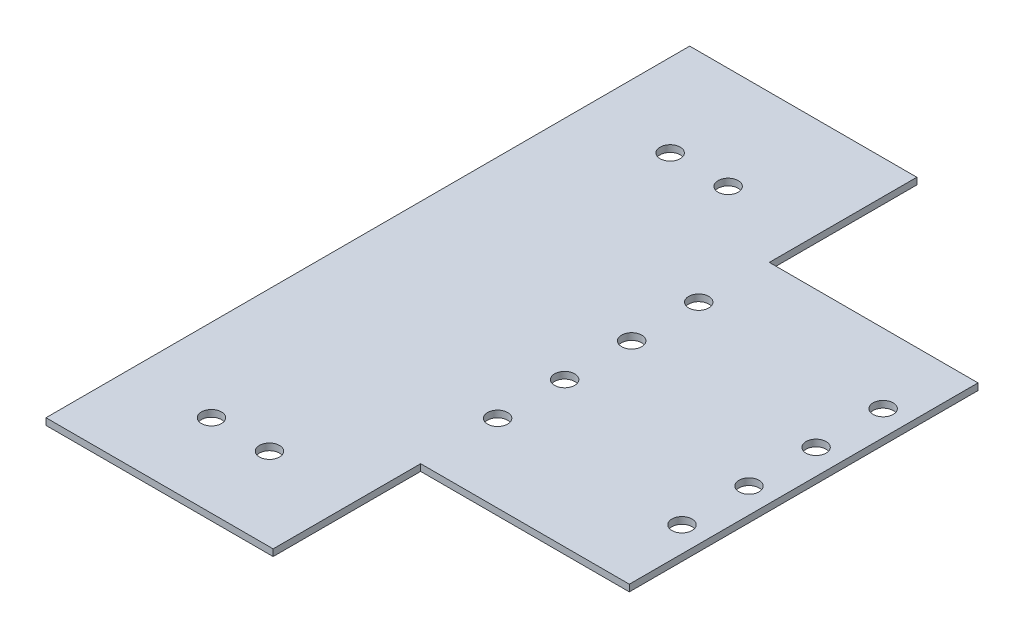
ISO-10303-21;
HEADER;
FILE_DESCRIPTION(('STEP AP214'),'2;1');
FILE_NAME('part.step','',(''),(''),'','','');
FILE_SCHEMA(('AUTOMOTIVE_DESIGN { 1 0 10303 214 1 1 1 1 }'));
ENDSEC;
DATA;
#1=APPLICATION_CONTEXT('core data for automotive mechanical design processes');
#2=APPLICATION_PROTOCOL_DEFINITION('international standard','automotive_design',2000,#1);
#3=PRODUCT_CONTEXT('',#1,'mechanical');
#4=PRODUCT('Part','Part','',(#3));
#5=PRODUCT_RELATED_PRODUCT_CATEGORY('part','',(#4));
#6=PRODUCT_DEFINITION_FORMATION('','',#4);
#7=PRODUCT_DEFINITION_CONTEXT('part definition',#1,'design');
#8=PRODUCT_DEFINITION('design','',#6,#7);
#9=PRODUCT_DEFINITION_SHAPE('','',#8);
#10=(LENGTH_UNIT() NAMED_UNIT(*) SI_UNIT(.MILLI.,.METRE.));
#11=(NAMED_UNIT(*) PLANE_ANGLE_UNIT() SI_UNIT($,.RADIAN.));
#12=(NAMED_UNIT(*) SI_UNIT($,.STERADIAN.) SOLID_ANGLE_UNIT());
#13=UNCERTAINTY_MEASURE_WITH_UNIT(LENGTH_MEASURE(1.E-05),#10,'distance_accuracy_value','');
#14=(GEOMETRIC_REPRESENTATION_CONTEXT(3) GLOBAL_UNCERTAINTY_ASSIGNED_CONTEXT((#13)) GLOBAL_UNIT_ASSIGNED_CONTEXT((#10,
#11,#12)) REPRESENTATION_CONTEXT('',''));
#15=CARTESIAN_POINT('',(0.,0.,0.));
#16=DIRECTION('',(0.,0.,1.));
#17=DIRECTION('',(1.,0.,0.));
#18=AXIS2_PLACEMENT_3D('',#15,#16,#17);
#19=CARTESIAN_POINT('',(0.,1.,0.));
#20=DIRECTION('',(0.,-1.,0.));
#21=DIRECTION('',(0.,0.,-1.));
#22=AXIS2_PLACEMENT_3D('',#19,#20,#21);
#23=PLANE('',#22);
#24=CARTESIAN_POINT('',(5.92356900920418,1.,35.6602207894241));
#25=DIRECTION('',(0.,1.,0.));
#26=DIRECTION('',(0.,0.,1.));
#27=AXIS2_PLACEMENT_3D('',#24,#25,#26);
#28=CIRCLE('',#27,1.5);
#29=CARTESIAN_POINT('',(5.92356900920418,1.,37.1602207894241));
#30=VERTEX_POINT('',#29);
#31=EDGE_CURVE('E239',#30,#30,#28,.T.);
#32=ORIENTED_EDGE('',*,*,#31,.F.);
#33=EDGE_LOOP('',(#32));
#34=FACE_BOUND('',#33,.T.);
#35=CARTESIAN_POINT('',(-2.72643099079582,1.,35.6602207894241));
#36=DIRECTION('',(0.,1.,0.));
#37=DIRECTION('',(0.,0.,1.));
#38=AXIS2_PLACEMENT_3D('',#35,#36,#37);
#39=CIRCLE('',#38,1.5);
#40=CARTESIAN_POINT('',(-2.72643099079582,1.,37.1602207894241));
#41=VERTEX_POINT('',#40);
#42=EDGE_CURVE('E257',#41,#41,#39,.T.);
#43=ORIENTED_EDGE('',*,*,#42,.F.);
#44=EDGE_LOOP('',(#43));
#45=FACE_BOUND('',#44,.T.);
#46=CARTESIAN_POINT('',(-2.72643099079582,1.,-32.7469767878305));
#47=DIRECTION('',(0.,1.,0.));
#48=DIRECTION('',(0.,0.,1.));
#49=AXIS2_PLACEMENT_3D('',#46,#47,#48);
#50=CIRCLE('',#49,1.5);
#51=CARTESIAN_POINT('',(-2.72643099079582,1.,-31.2469767878306));
#52=VERTEX_POINT('',#51);
#53=EDGE_CURVE('E254',#52,#52,#50,.T.);
#54=ORIENTED_EDGE('',*,*,#53,.F.);
#55=EDGE_LOOP('',(#54));
#56=FACE_BOUND('',#55,.T.);
#57=CARTESIAN_POINT('',(5.92356900920418,1.,-32.7469767878305));
#58=DIRECTION('',(0.,1.,0.));
#59=DIRECTION('',(0.,0.,1.));
#60=AXIS2_PLACEMENT_3D('',#57,#58,#59);
#61=CIRCLE('',#60,1.5);
#62=CARTESIAN_POINT('',(5.92356900920418,1.,-31.2469767878306));
#63=VERTEX_POINT('',#62);
#64=EDGE_CURVE('E183',#63,#63,#61,.T.);
#65=ORIENTED_EDGE('',*,*,#64,.F.);
#66=EDGE_LOOP('',(#65));
#67=FACE_BOUND('',#66,.T.);
#68=CARTESIAN_POINT('',(46.1837979810975,1.,-5.59999999995909));
#69=DIRECTION('',(0.,1.,0.));
#70=DIRECTION('',(0.,0.,1.));
#71=AXIS2_PLACEMENT_3D('',#68,#69,#70);
#72=CIRCLE('',#71,1.50000000001881);
#73=CARTESIAN_POINT('',(46.1837979810975,1.,-4.09999999994028));
#74=VERTEX_POINT('',#73);
#75=EDGE_CURVE('E205',#74,#74,#72,.T.);
#76=ORIENTED_EDGE('',*,*,#75,.F.);
#77=EDGE_LOOP('',(#76));
#78=FACE_BOUND('',#77,.T.);
#79=CARTESIAN_POINT('',(18.6837979810975,1.,4.40000000004091));
#80=DIRECTION('',(0.,1.,0.));
#81=DIRECTION('',(0.,0.,1.));
#82=AXIS2_PLACEMENT_3D('',#79,#80,#81);
#83=CIRCLE('',#82,1.50000000001833);
#84=CARTESIAN_POINT('',(18.6837979810975,1.,5.90000000005924));
#85=VERTEX_POINT('',#84);
#86=EDGE_CURVE('E207',#85,#85,#83,.T.);
#87=ORIENTED_EDGE('',*,*,#86,.F.);
#88=EDGE_LOOP('',(#87));
#89=FACE_BOUND('',#88,.T.);
#90=CARTESIAN_POINT('',(46.1837979810975,1.,4.40000000004091));
#91=DIRECTION('',(0.,1.,0.));
#92=DIRECTION('',(0.,0.,1.));
#93=AXIS2_PLACEMENT_3D('',#90,#91,#92);
#94=CIRCLE('',#93,1.50000000001881);
#95=CARTESIAN_POINT('',(46.1837979810975,1.,5.90000000005972));
#96=VERTEX_POINT('',#95);
#97=EDGE_CURVE('E210',#96,#96,#94,.T.);
#98=ORIENTED_EDGE('',*,*,#97,.F.);
#99=EDGE_LOOP('',(#98));
#100=FACE_BOUND('',#99,.T.);
#101=CARTESIAN_POINT('',(18.6837979810975,1.,14.4000000000409));
#102=DIRECTION('',(0.,1.,0.));
#103=DIRECTION('',(0.,0.,1.));
#104=AXIS2_PLACEMENT_3D('',#101,#102,#103);
#105=CIRCLE('',#104,1.50000000001833);
#106=CARTESIAN_POINT('',(18.6837979810975,1.,15.9000000000592));
#107=VERTEX_POINT('',#106);
#108=EDGE_CURVE('E213',#107,#107,#105,.T.);
#109=ORIENTED_EDGE('',*,*,#108,.F.);
#110=EDGE_LOOP('',(#109));
#111=FACE_BOUND('',#110,.T.);
#112=CARTESIAN_POINT('',(18.6837979810974,1.,-15.5999999999591));
#113=DIRECTION('',(0.,1.,0.));
#114=DIRECTION('',(0.,0.,1.));
#115=AXIS2_PLACEMENT_3D('',#112,#113,#114);
#116=CIRCLE('',#115,1.50000000001833);
#117=CARTESIAN_POINT('',(18.6837979810974,1.,-14.0999999999408));
#118=VERTEX_POINT('',#117);
#119=EDGE_CURVE('E190',#118,#118,#116,.T.);
#120=ORIENTED_EDGE('',*,*,#119,.F.);
#121=EDGE_LOOP('',(#120));
#122=FACE_BOUND('',#121,.T.);
#123=CARTESIAN_POINT('',(46.1837979810974,1.,-15.5999999999591));
#124=DIRECTION('',(0.,1.,0.));
#125=DIRECTION('',(0.,0.,1.));
#126=AXIS2_PLACEMENT_3D('',#123,#124,#125);
#127=CIRCLE('',#126,1.50000000001881);
#128=CARTESIAN_POINT('',(46.1837979810974,1.,-14.0999999999403));
#129=VERTEX_POINT('',#128);
#130=EDGE_CURVE('E194',#129,#129,#127,.T.);
#131=ORIENTED_EDGE('',*,*,#130,.F.);
#132=EDGE_LOOP('',(#131));
#133=FACE_BOUND('',#132,.T.);
#134=CARTESIAN_POINT('',(18.6837979810975,1.,-5.59999999995909));
#135=DIRECTION('',(0.,1.,0.));
#136=DIRECTION('',(0.,0.,1.));
#137=AXIS2_PLACEMENT_3D('',#134,#135,#136);
#138=CIRCLE('',#137,1.50000000001833);
#139=CARTESIAN_POINT('',(18.6837979810975,1.,-4.09999999994076));
#140=VERTEX_POINT('',#139);
#141=EDGE_CURVE('E199',#140,#140,#138,.T.);
#142=ORIENTED_EDGE('',*,*,#141,.F.);
#143=EDGE_LOOP('',(#142));
#144=FACE_BOUND('',#143,.T.);
#145=CARTESIAN_POINT('',(46.1837979810975,1.,14.4000000000409));
#146=DIRECTION('',(0.,1.,0.));
#147=DIRECTION('',(0.,0.,1.));
#148=AXIS2_PLACEMENT_3D('',#145,#146,#147);
#149=CIRCLE('',#148,1.50000000001881);
#150=CARTESIAN_POINT('',(46.1837979810975,1.,15.9000000000597));
#151=VERTEX_POINT('',#150);
#152=EDGE_CURVE('E159',#151,#151,#149,.T.);
#153=ORIENTED_EDGE('',*,*,#152,.F.);
#154=EDGE_LOOP('',(#153));
#155=FACE_BOUND('',#154,.T.);
#156=DIRECTION('',(-1.,0.,0.));
#157=VECTOR('',#156,1.);
#158=CARTESIAN_POINT('',(15.,1.,-47.999999999969));
#159=LINE('',#158,#157);
#160=CARTESIAN_POINT('',(18.8099324408469,1.,-47.999999999969));
#161=VERTEX_POINT('',#160);
#162=CARTESIAN_POINT('',(-15.0662020189026,1.,-47.999999999969));
#163=VERTEX_POINT('',#162);
#164=EDGE_CURVE('E130',#161,#163,#159,.T.);
#165=ORIENTED_EDGE('',*,*,#164,.T.);
#166=DIRECTION('',(0.,0.,1.));
#167=VECTOR('',#166,1.);
#168=CARTESIAN_POINT('',(-15.0662020189026,1.,0.));
#169=LINE('',#168,#167);
#170=CARTESIAN_POINT('',(-15.0662020189026,0.999999999999999,48.000000000031));
#171=VERTEX_POINT('',#170);
#172=EDGE_CURVE('E52',#163,#171,#169,.T.);
#173=ORIENTED_EDGE('',*,*,#172,.T.);
#174=DIRECTION('',(1.,0.,1.61649475190916E-13));
#175=VECTOR('',#174,1.);
#176=CARTESIAN_POINT('',(-48.9590812442226,1.,48.000000000031));
#177=LINE('',#176,#175);
#178=CARTESIAN_POINT('',(18.8099324408469,1.,48.0000000000413));
#179=VERTEX_POINT('',#178);
#180=EDGE_CURVE('E96',#171,#179,#177,.T.);
#181=ORIENTED_EDGE('',*,*,#180,.T.);
#182=DIRECTION('',(0.,0.,-1.));
#183=VECTOR('',#182,1.);
#184=CARTESIAN_POINT('',(18.8099324408469,1.,26.000000000031));
#185=LINE('',#184,#183);
#186=CARTESIAN_POINT('',(18.8099324408469,1.,26.000000000031));
#187=VERTEX_POINT('',#186);
#188=EDGE_CURVE('E221',#179,#187,#185,.T.);
#189=ORIENTED_EDGE('',*,*,#188,.T.);
#190=DIRECTION('',(1.,0.,0.));
#191=VECTOR('',#190,1.);
#192=CARTESIAN_POINT('',(49.9337979810974,1.,26.000000000031));
#193=LINE('',#192,#191);
#194=CARTESIAN_POINT('',(49.9337979810974,1.,26.000000000031));
#195=VERTEX_POINT('',#194);
#196=EDGE_CURVE('E112',#187,#195,#193,.T.);
#197=ORIENTED_EDGE('',*,*,#196,.T.);
#198=DIRECTION('',(0.,0.,-1.));
#199=VECTOR('',#198,1.);
#200=CARTESIAN_POINT('',(49.9337979810974,1.,-25.9999999999587));
#201=LINE('',#200,#199);
#202=CARTESIAN_POINT('',(49.9337979810974,1.,-25.9999999999587));
#203=VERTEX_POINT('',#202);
#204=EDGE_CURVE('E106',#195,#203,#201,.T.);
#205=ORIENTED_EDGE('',*,*,#204,.T.);
#206=DIRECTION('',(-1.,0.,0.));
#207=VECTOR('',#206,1.);
#208=CARTESIAN_POINT('',(49.9337979810974,1.,-25.9999999999587));
#209=LINE('',#208,#207);
#210=CARTESIAN_POINT('',(18.8099324408469,1.,-25.9999999999587));
#211=VERTEX_POINT('',#210);
#212=EDGE_CURVE('E109',#203,#211,#209,.T.);
#213=ORIENTED_EDGE('',*,*,#212,.T.);
#214=DIRECTION('',(0.,0.,-1.));
#215=VECTOR('',#214,1.);
#216=CARTESIAN_POINT('',(18.8099324408469,1.,-25.9999999999587));
#217=LINE('',#216,#215);
#218=EDGE_CURVE('E61',#211,#161,#217,.T.);
#219=ORIENTED_EDGE('',*,*,#218,.T.);
#220=EDGE_LOOP('',(#165,#173,#181,#189,#197,#205,#213,#219));
#221=FACE_BOUND('',#220,.T.);
#222=ADVANCED_FACE('F35',(#34,#45,#56,#67,#78,#89,#100,#111,#122,#133,#144,#155,#221),#23,.F.);
#223=CARTESIAN_POINT('',(0.,0.,0.));
#224=DIRECTION('',(0.,-1.,0.));
#225=DIRECTION('',(0.,0.,-1.));
#226=AXIS2_PLACEMENT_3D('',#223,#224,#225);
#227=PLANE('',#226);
#228=DIRECTION('',(0.,0.,1.));
#229=VECTOR('',#228,1.);
#230=CARTESIAN_POINT('',(-15.0662020189026,0.,-47.9999999999586));
#231=LINE('',#230,#229);
#232=CARTESIAN_POINT('',(-15.0662020189026,0.,-47.9999999999586));
#233=VERTEX_POINT('',#232);
#234=CARTESIAN_POINT('',(-15.0662020189026,0.,48.000000000031));
#235=VERTEX_POINT('',#234);
#236=EDGE_CURVE('E247',#233,#235,#231,.T.);
#237=ORIENTED_EDGE('',*,*,#236,.F.);
#238=DIRECTION('',(-1.,0.,1.61866454352247E-13));
#239=VECTOR('',#238,1.);
#240=CARTESIAN_POINT('',(-48.9590812442226,0.,-47.9999999999586));
#241=LINE('',#240,#239);
#242=CARTESIAN_POINT('',(18.8099324408469,0.,-47.999999999969));
#243=VERTEX_POINT('',#242);
#244=EDGE_CURVE('E89',#243,#233,#241,.T.);
#245=ORIENTED_EDGE('',*,*,#244,.F.);
#246=DIRECTION('',(0.,0.,-1.));
#247=VECTOR('',#246,1.);
#248=CARTESIAN_POINT('',(18.8099324408469,0.,-25.9999999999587));
#249=LINE('',#248,#247);
#250=CARTESIAN_POINT('',(18.8099324408469,0.,-25.9999999999587));
#251=VERTEX_POINT('',#250);
#252=EDGE_CURVE('E146',#251,#243,#249,.T.);
#253=ORIENTED_EDGE('',*,*,#252,.F.);
#254=DIRECTION('',(-1.,0.,0.));
#255=VECTOR('',#254,1.);
#256=CARTESIAN_POINT('',(49.9337979810974,0.,-25.9999999999587));
#257=LINE('',#256,#255);
#258=CARTESIAN_POINT('',(49.9337979810974,0.,-25.9999999999587));
#259=VERTEX_POINT('',#258);
#260=EDGE_CURVE('E144',#259,#251,#257,.T.);
#261=ORIENTED_EDGE('',*,*,#260,.F.);
#262=DIRECTION('',(0.,0.,-1.));
#263=VECTOR('',#262,1.);
#264=CARTESIAN_POINT('',(49.9337979810974,0.,-25.9999999999587));
#265=LINE('',#264,#263);
#266=CARTESIAN_POINT('',(49.9337979810974,0.,26.000000000031));
#267=VERTEX_POINT('',#266);
#268=EDGE_CURVE('E121',#267,#259,#265,.T.);
#269=ORIENTED_EDGE('',*,*,#268,.F.);
#270=DIRECTION('',(1.,0.,0.));
#271=VECTOR('',#270,1.);
#272=CARTESIAN_POINT('',(49.9337979810974,0.,26.000000000031));
#273=LINE('',#272,#271);
#274=CARTESIAN_POINT('',(18.8099324408469,0.,26.000000000031));
#275=VERTEX_POINT('',#274);
#276=EDGE_CURVE('E141',#275,#267,#273,.T.);
#277=ORIENTED_EDGE('',*,*,#276,.F.);
#278=DIRECTION('',(0.,0.,-1.));
#279=VECTOR('',#278,1.);
#280=CARTESIAN_POINT('',(18.8099324408469,0.,26.000000000031));
#281=LINE('',#280,#279);
#282=CARTESIAN_POINT('',(18.8099324408469,0.,48.0000000000413));
#283=VERTEX_POINT('',#282);
#284=EDGE_CURVE('E138',#283,#275,#281,.T.);
#285=ORIENTED_EDGE('',*,*,#284,.F.);
#286=DIRECTION('',(1.,0.,0.));
#287=VECTOR('',#286,1.);
#288=CARTESIAN_POINT('',(15.,0.,48.0000000000413));
#289=LINE('',#288,#287);
#290=EDGE_CURVE('E136',#235,#283,#289,.T.);
#291=ORIENTED_EDGE('',*,*,#290,.F.);
#292=EDGE_LOOP('',(#237,#245,#253,#261,#269,#277,#285,#291));
#293=FACE_BOUND('',#292,.T.);
#294=CARTESIAN_POINT('',(5.92356900920418,0.,35.6602207894241));
#295=DIRECTION('',(0.,-1.,0.));
#296=DIRECTION('',(0.,0.,-1.));
#297=AXIS2_PLACEMENT_3D('',#294,#295,#296);
#298=CIRCLE('',#297,1.5);
#299=CARTESIAN_POINT('',(5.92356900920418,0.,34.1602207894241));
#300=VERTEX_POINT('',#299);
#301=EDGE_CURVE('E39',#300,#300,#298,.T.);
#302=ORIENTED_EDGE('',*,*,#301,.F.);
#303=EDGE_LOOP('',(#302));
#304=FACE_BOUND('',#303,.T.);
#305=CARTESIAN_POINT('',(-2.72643099079582,0.,35.6602207894241));
#306=DIRECTION('',(0.,-1.,0.));
#307=DIRECTION('',(0.,0.,-1.));
#308=AXIS2_PLACEMENT_3D('',#305,#306,#307);
#309=CIRCLE('',#308,1.5);
#310=CARTESIAN_POINT('',(-2.72643099079582,0.,34.1602207894241));
#311=VERTEX_POINT('',#310);
#312=EDGE_CURVE('E185',#311,#311,#309,.T.);
#313=ORIENTED_EDGE('',*,*,#312,.F.);
#314=EDGE_LOOP('',(#313));
#315=FACE_BOUND('',#314,.T.);
#316=CARTESIAN_POINT('',(-2.72643099079582,0.,-32.7469767878305));
#317=DIRECTION('',(0.,-1.,0.));
#318=DIRECTION('',(0.,0.,-1.));
#319=AXIS2_PLACEMENT_3D('',#316,#317,#318);
#320=CIRCLE('',#319,1.5);
#321=CARTESIAN_POINT('',(-2.72643099079582,0.,-34.2469767878305));
#322=VERTEX_POINT('',#321);
#323=EDGE_CURVE('E182',#322,#322,#320,.T.);
#324=ORIENTED_EDGE('',*,*,#323,.F.);
#325=EDGE_LOOP('',(#324));
#326=FACE_BOUND('',#325,.T.);
#327=CARTESIAN_POINT('',(5.92356900920418,0.,-32.7469767878305));
#328=DIRECTION('',(0.,-1.,0.));
#329=DIRECTION('',(0.,0.,-1.));
#330=AXIS2_PLACEMENT_3D('',#327,#328,#329);
#331=CIRCLE('',#330,1.5);
#332=CARTESIAN_POINT('',(5.92356900920418,0.,-34.2469767878305));
#333=VERTEX_POINT('',#332);
#334=EDGE_CURVE('E179',#333,#333,#331,.T.);
#335=ORIENTED_EDGE('',*,*,#334,.F.);
#336=EDGE_LOOP('',(#335));
#337=FACE_BOUND('',#336,.T.);
#338=CARTESIAN_POINT('',(46.1837979810975,0.,-5.59999999995909));
#339=DIRECTION('',(0.,-1.,0.));
#340=DIRECTION('',(0.,0.,-1.));
#341=AXIS2_PLACEMENT_3D('',#338,#339,#340);
#342=CIRCLE('',#341,1.50000000001881);
#343=CARTESIAN_POINT('',(46.1837979810975,0.,-7.0999999999779));
#344=VERTEX_POINT('',#343);
#345=EDGE_CURVE('E139',#344,#344,#342,.T.);
#346=ORIENTED_EDGE('',*,*,#345,.F.);
#347=EDGE_LOOP('',(#346));
#348=FACE_BOUND('',#347,.T.);
#349=CARTESIAN_POINT('',(18.6837979810975,0.,4.40000000004091));
#350=DIRECTION('',(0.,-1.,0.));
#351=DIRECTION('',(0.,0.,-1.));
#352=AXIS2_PLACEMENT_3D('',#349,#350,#351);
#353=CIRCLE('',#352,1.50000000001833);
#354=CARTESIAN_POINT('',(18.6837979810975,0.,2.90000000002258));
#355=VERTEX_POINT('',#354);
#356=EDGE_CURVE('E174',#355,#355,#353,.T.);
#357=ORIENTED_EDGE('',*,*,#356,.F.);
#358=EDGE_LOOP('',(#357));
#359=FACE_BOUND('',#358,.T.);
#360=CARTESIAN_POINT('',(46.1837979810975,0.,4.40000000004091));
#361=DIRECTION('',(0.,-1.,0.));
#362=DIRECTION('',(0.,0.,-1.));
#363=AXIS2_PLACEMENT_3D('',#360,#361,#362);
#364=CIRCLE('',#363,1.50000000001881);
#365=CARTESIAN_POINT('',(46.1837979810975,0.,2.9000000000221));
#366=VERTEX_POINT('',#365);
#367=EDGE_CURVE('E171',#366,#366,#364,.T.);
#368=ORIENTED_EDGE('',*,*,#367,.F.);
#369=EDGE_LOOP('',(#368));
#370=FACE_BOUND('',#369,.T.);
#371=CARTESIAN_POINT('',(18.6837979810975,0.,14.4000000000409));
#372=DIRECTION('',(0.,-1.,0.));
#373=DIRECTION('',(0.,0.,-1.));
#374=AXIS2_PLACEMENT_3D('',#371,#372,#373);
#375=CIRCLE('',#374,1.50000000001833);
#376=CARTESIAN_POINT('',(18.6837979810975,0.,12.9000000000226));
#377=VERTEX_POINT('',#376);
#378=EDGE_CURVE('E168',#377,#377,#375,.T.);
#379=ORIENTED_EDGE('',*,*,#378,.F.);
#380=EDGE_LOOP('',(#379));
#381=FACE_BOUND('',#380,.T.);
#382=CARTESIAN_POINT('',(18.6837979810974,0.,-15.5999999999591));
#383=DIRECTION('',(0.,-1.,0.));
#384=DIRECTION('',(0.,0.,-1.));
#385=AXIS2_PLACEMENT_3D('',#382,#383,#384);
#386=CIRCLE('',#385,1.50000000001833);
#387=CARTESIAN_POINT('',(18.6837979810974,0.,-17.0999999999774));
#388=VERTEX_POINT('',#387);
#389=EDGE_CURVE('E165',#388,#388,#386,.T.);
#390=ORIENTED_EDGE('',*,*,#389,.F.);
#391=EDGE_LOOP('',(#390));
#392=FACE_BOUND('',#391,.T.);
#393=CARTESIAN_POINT('',(46.1837979810974,0.,-15.5999999999591));
#394=DIRECTION('',(0.,-1.,0.));
#395=DIRECTION('',(0.,0.,-1.));
#396=AXIS2_PLACEMENT_3D('',#393,#394,#395);
#397=CIRCLE('',#396,1.50000000001881);
#398=CARTESIAN_POINT('',(46.1837979810974,0.,-17.0999999999779));
#399=VERTEX_POINT('',#398);
#400=EDGE_CURVE('E162',#399,#399,#397,.T.);
#401=ORIENTED_EDGE('',*,*,#400,.F.);
#402=EDGE_LOOP('',(#401));
#403=FACE_BOUND('',#402,.T.);
#404=CARTESIAN_POINT('',(18.6837979810975,0.,-5.59999999995909));
#405=DIRECTION('',(0.,-1.,0.));
#406=DIRECTION('',(0.,0.,-1.));
#407=AXIS2_PLACEMENT_3D('',#404,#405,#406);
#408=CIRCLE('',#407,1.50000000001833);
#409=CARTESIAN_POINT('',(18.6837979810975,0.,-7.09999999997742));
#410=VERTEX_POINT('',#409);
#411=EDGE_CURVE('E158',#410,#410,#408,.T.);
#412=ORIENTED_EDGE('',*,*,#411,.F.);
#413=EDGE_LOOP('',(#412));
#414=FACE_BOUND('',#413,.T.);
#415=CARTESIAN_POINT('',(46.1837979810975,0.,14.4000000000409));
#416=DIRECTION('',(0.,-1.,0.));
#417=DIRECTION('',(0.,0.,-1.));
#418=AXIS2_PLACEMENT_3D('',#415,#416,#417);
#419=CIRCLE('',#418,1.50000000001881);
#420=CARTESIAN_POINT('',(46.1837979810975,0.,12.9000000000221));
#421=VERTEX_POINT('',#420);
#422=EDGE_CURVE('E155',#421,#421,#419,.T.);
#423=ORIENTED_EDGE('',*,*,#422,.F.);
#424=EDGE_LOOP('',(#423));
#425=FACE_BOUND('',#424,.T.);
#426=ADVANCED_FACE('F230',(#293,#304,#315,#326,#337,#348,#359,#370,#381,#392,#403,#414,#425),
#227,.T.);
#427=CARTESIAN_POINT('',(15.,1.,48.0000000000413));
#428=DIRECTION('',(0.,0.,-1.));
#429=DIRECTION('',(-1.,0.,0.));
#430=AXIS2_PLACEMENT_3D('',#427,#428,#429);
#431=PLANE('',#430);
#432=ORIENTED_EDGE('',*,*,#180,.F.);
#433=DIRECTION('',(0.,-1.,0.));
#434=VECTOR('',#433,1.);
#435=CARTESIAN_POINT('',(-15.0662020189026,10.,48.000000000031));
#436=LINE('',#435,#434);
#437=EDGE_CURVE('E240',#171,#235,#436,.T.);
#438=ORIENTED_EDGE('',*,*,#437,.T.);
#439=ORIENTED_EDGE('',*,*,#290,.T.);
#440=DIRECTION('',(0.,-1.,0.));
#441=VECTOR('',#440,1.);
#442=CARTESIAN_POINT('',(18.8099324408469,1.,48.0000000000413));
#443=LINE('',#442,#441);
#444=EDGE_CURVE('E11',#179,#283,#443,.T.);
#445=ORIENTED_EDGE('',*,*,#444,.F.);
#446=EDGE_LOOP('',(#432,#438,#439,#445));
#447=FACE_BOUND('',#446,.T.);
#448=ADVANCED_FACE('F37',(#447),#431,.F.);
#449=CARTESIAN_POINT('',(18.8099324408469,1.,26.000000000031));
#450=DIRECTION('',(-1.,0.,0.));
#451=DIRECTION('',(0.,0.,1.));
#452=AXIS2_PLACEMENT_3D('',#449,#450,#451);
#453=PLANE('',#452);
#454=ORIENTED_EDGE('',*,*,#284,.T.);
#455=DIRECTION('',(0.,-1.,0.));
#456=VECTOR('',#455,1.);
#457=CARTESIAN_POINT('',(18.8099324408469,1.,26.000000000031));
#458=LINE('',#457,#456);
#459=EDGE_CURVE('E44',#187,#275,#458,.T.);
#460=ORIENTED_EDGE('',*,*,#459,.F.);
#461=ORIENTED_EDGE('',*,*,#188,.F.);
#462=ORIENTED_EDGE('',*,*,#444,.T.);
#463=EDGE_LOOP('',(#454,#460,#461,#462));
#464=FACE_BOUND('',#463,.T.);
#465=ADVANCED_FACE('F225',(#464),#453,.F.);
#466=CARTESIAN_POINT('',(49.9337979810974,1.,26.000000000031));
#467=DIRECTION('',(0.,0.,-1.));
#468=DIRECTION('',(-1.,0.,0.));
#469=AXIS2_PLACEMENT_3D('',#466,#467,#468);
#470=PLANE('',#469);
#471=ORIENTED_EDGE('',*,*,#276,.T.);
#472=DIRECTION('',(0.,-1.,0.));
#473=VECTOR('',#472,1.);
#474=CARTESIAN_POINT('',(49.9337979810974,1.,26.000000000031));
#475=LINE('',#474,#473);
#476=EDGE_CURVE('E124',#195,#267,#475,.T.);
#477=ORIENTED_EDGE('',*,*,#476,.F.);
#478=ORIENTED_EDGE('',*,*,#196,.F.);
#479=ORIENTED_EDGE('',*,*,#459,.T.);
#480=EDGE_LOOP('',(#471,#477,#478,#479));
#481=FACE_BOUND('',#480,.T.);
#482=ADVANCED_FACE('F229',(#481),#470,.F.);
#483=CARTESIAN_POINT('',(49.9337979810974,1.,-25.9999999999587));
#484=DIRECTION('',(-1.,0.,0.));
#485=DIRECTION('',(0.,0.,1.));
#486=AXIS2_PLACEMENT_3D('',#483,#484,#485);
#487=PLANE('',#486);
#488=ORIENTED_EDGE('',*,*,#268,.T.);
#489=DIRECTION('',(0.,-1.,0.));
#490=VECTOR('',#489,1.);
#491=CARTESIAN_POINT('',(49.9337979810974,1.,-25.9999999999587));
#492=LINE('',#491,#490);
#493=EDGE_CURVE('E118',#203,#259,#492,.T.);
#494=ORIENTED_EDGE('',*,*,#493,.F.);
#495=ORIENTED_EDGE('',*,*,#204,.F.);
#496=ORIENTED_EDGE('',*,*,#476,.T.);
#497=EDGE_LOOP('',(#488,#494,#495,#496));
#498=FACE_BOUND('',#497,.T.);
#499=ADVANCED_FACE('F119',(#498),#487,.F.);
#500=CARTESIAN_POINT('',(49.9337979810974,1.,-25.9999999999587));
#501=DIRECTION('',(0.,0.,1.));
#502=DIRECTION('',(1.,0.,0.));
#503=AXIS2_PLACEMENT_3D('',#500,#501,#502);
#504=PLANE('',#503);
#505=ORIENTED_EDGE('',*,*,#260,.T.);
#506=DIRECTION('',(0.,-1.,0.));
#507=VECTOR('',#506,1.);
#508=CARTESIAN_POINT('',(18.8099324408469,1.,-25.9999999999587));
#509=LINE('',#508,#507);
#510=EDGE_CURVE('E125',#211,#251,#509,.T.);
#511=ORIENTED_EDGE('',*,*,#510,.F.);
#512=ORIENTED_EDGE('',*,*,#212,.F.);
#513=ORIENTED_EDGE('',*,*,#493,.T.);
#514=EDGE_LOOP('',(#505,#511,#512,#513));
#515=FACE_BOUND('',#514,.T.);
#516=ADVANCED_FACE('F127',(#515),#504,.F.);
#517=CARTESIAN_POINT('',(18.8099324408469,1.,-25.9999999999587));
#518=DIRECTION('',(-1.,0.,0.));
#519=DIRECTION('',(0.,0.,1.));
#520=AXIS2_PLACEMENT_3D('',#517,#518,#519);
#521=PLANE('',#520);
#522=ORIENTED_EDGE('',*,*,#252,.T.);
#523=DIRECTION('',(0.,-1.,0.));
#524=VECTOR('',#523,1.);
#525=CARTESIAN_POINT('',(18.8099324408469,1.,-47.999999999969));
#526=LINE('',#525,#524);
#527=EDGE_CURVE('E135',#161,#243,#526,.T.);
#528=ORIENTED_EDGE('',*,*,#527,.F.);
#529=ORIENTED_EDGE('',*,*,#218,.F.);
#530=ORIENTED_EDGE('',*,*,#510,.T.);
#531=EDGE_LOOP('',(#522,#528,#529,#530));
#532=FACE_BOUND('',#531,.T.);
#533=ADVANCED_FACE('F233',(#532),#521,.F.);
#534=CARTESIAN_POINT('',(-48.9590812442226,1.,-47.9999999999586));
#535=DIRECTION('',(1.61866454352247E-13,0.,1.));
#536=DIRECTION('',(1.,0.,-1.61866454352247E-13));
#537=AXIS2_PLACEMENT_3D('',#534,#535,#536);
#538=PLANE('',#537);
#539=ORIENTED_EDGE('',*,*,#244,.T.);
#540=DIRECTION('',(0.,-1.,0.));
#541=VECTOR('',#540,1.);
#542=CARTESIAN_POINT('',(-15.0662020189026,10.,-47.9999999999586));
#543=LINE('',#542,#541);
#544=EDGE_CURVE('E237',#163,#233,#543,.T.);
#545=ORIENTED_EDGE('',*,*,#544,.F.);
#546=ORIENTED_EDGE('',*,*,#164,.F.);
#547=ORIENTED_EDGE('',*,*,#527,.T.);
#548=EDGE_LOOP('',(#539,#545,#546,#547));
#549=FACE_BOUND('',#548,.T.);
#550=ADVANCED_FACE('F236',(#549),#538,.F.);
#551=CARTESIAN_POINT('',(46.1837979810975,-9.,14.4000000000409));
#552=DIRECTION('',(0.,1.,0.));
#553=DIRECTION('',(0.,0.,1.));
#554=AXIS2_PLACEMENT_3D('',#551,#552,#553);
#555=CYLINDRICAL_SURFACE('',#554,1.50000000001881);
#556=ORIENTED_EDGE('',*,*,#422,.T.);
#557=EDGE_LOOP('',(#556));
#558=FACE_BOUND('',#557,.T.);
#559=ORIENTED_EDGE('',*,*,#152,.T.);
#560=EDGE_LOOP('',(#559));
#561=FACE_BOUND('',#560,.T.);
#562=ADVANCED_FACE('F289',(#558,#561),#555,.F.);
#563=CARTESIAN_POINT('',(18.6837979810975,-9.,-5.59999999995909));
#564=DIRECTION('',(0.,1.,0.));
#565=DIRECTION('',(0.,0.,1.));
#566=AXIS2_PLACEMENT_3D('',#563,#564,#565);
#567=CYLINDRICAL_SURFACE('',#566,1.50000000001833);
#568=ORIENTED_EDGE('',*,*,#411,.T.);
#569=EDGE_LOOP('',(#568));
#570=FACE_BOUND('',#569,.T.);
#571=ORIENTED_EDGE('',*,*,#141,.T.);
#572=EDGE_LOOP('',(#571));
#573=FACE_BOUND('',#572,.T.);
#574=ADVANCED_FACE('F291',(#570,#573),#567,.F.);
#575=CARTESIAN_POINT('',(46.1837979810974,-9.,-15.5999999999591));
#576=DIRECTION('',(0.,1.,0.));
#577=DIRECTION('',(0.,0.,1.));
#578=AXIS2_PLACEMENT_3D('',#575,#576,#577);
#579=CYLINDRICAL_SURFACE('',#578,1.50000000001881);
#580=ORIENTED_EDGE('',*,*,#400,.T.);
#581=EDGE_LOOP('',(#580));
#582=FACE_BOUND('',#581,.T.);
#583=ORIENTED_EDGE('',*,*,#130,.T.);
#584=EDGE_LOOP('',(#583));
#585=FACE_BOUND('',#584,.T.);
#586=ADVANCED_FACE('F298',(#582,#585),#579,.F.);
#587=CARTESIAN_POINT('',(18.6837979810974,-9.,-15.5999999999591));
#588=DIRECTION('',(0.,1.,0.));
#589=DIRECTION('',(0.,0.,1.));
#590=AXIS2_PLACEMENT_3D('',#587,#588,#589);
#591=CYLINDRICAL_SURFACE('',#590,1.50000000001833);
#592=ORIENTED_EDGE('',*,*,#389,.T.);
#593=EDGE_LOOP('',(#592));
#594=FACE_BOUND('',#593,.T.);
#595=ORIENTED_EDGE('',*,*,#119,.T.);
#596=EDGE_LOOP('',(#595));
#597=FACE_BOUND('',#596,.T.);
#598=ADVANCED_FACE('F407',(#594,#597),#591,.F.);
#599=CARTESIAN_POINT('',(18.6837979810975,-9.,14.4000000000409));
#600=DIRECTION('',(0.,1.,0.));
#601=DIRECTION('',(0.,0.,1.));
#602=AXIS2_PLACEMENT_3D('',#599,#600,#601);
#603=CYLINDRICAL_SURFACE('',#602,1.50000000001833);
#604=ORIENTED_EDGE('',*,*,#378,.T.);
#605=EDGE_LOOP('',(#604));
#606=FACE_BOUND('',#605,.T.);
#607=ORIENTED_EDGE('',*,*,#108,.T.);
#608=EDGE_LOOP('',(#607));
#609=FACE_BOUND('',#608,.T.);
#610=ADVANCED_FACE('F398',(#606,#609),#603,.F.);
#611=CARTESIAN_POINT('',(46.1837979810975,-9.,4.40000000004091));
#612=DIRECTION('',(0.,1.,0.));
#613=DIRECTION('',(0.,0.,1.));
#614=AXIS2_PLACEMENT_3D('',#611,#612,#613);
#615=CYLINDRICAL_SURFACE('',#614,1.50000000001881);
#616=ORIENTED_EDGE('',*,*,#367,.T.);
#617=EDGE_LOOP('',(#616));
#618=FACE_BOUND('',#617,.T.);
#619=ORIENTED_EDGE('',*,*,#97,.T.);
#620=EDGE_LOOP('',(#619));
#621=FACE_BOUND('',#620,.T.);
#622=ADVANCED_FACE('F303',(#618,#621),#615,.F.);
#623=CARTESIAN_POINT('',(18.6837979810975,-9.,4.40000000004091));
#624=DIRECTION('',(0.,1.,0.));
#625=DIRECTION('',(0.,0.,1.));
#626=AXIS2_PLACEMENT_3D('',#623,#624,#625);
#627=CYLINDRICAL_SURFACE('',#626,1.50000000001833);
#628=ORIENTED_EDGE('',*,*,#356,.T.);
#629=EDGE_LOOP('',(#628));
#630=FACE_BOUND('',#629,.T.);
#631=ORIENTED_EDGE('',*,*,#86,.T.);
#632=EDGE_LOOP('',(#631));
#633=FACE_BOUND('',#632,.T.);
#634=ADVANCED_FACE('F379',(#630,#633),#627,.F.);
#635=CARTESIAN_POINT('',(46.1837979810975,-9.,-5.59999999995909));
#636=DIRECTION('',(0.,1.,0.));
#637=DIRECTION('',(0.,0.,1.));
#638=AXIS2_PLACEMENT_3D('',#635,#636,#637);
#639=CYLINDRICAL_SURFACE('',#638,1.50000000001881);
#640=ORIENTED_EDGE('',*,*,#345,.T.);
#641=EDGE_LOOP('',(#640));
#642=FACE_BOUND('',#641,.T.);
#643=ORIENTED_EDGE('',*,*,#75,.T.);
#644=EDGE_LOOP('',(#643));
#645=FACE_BOUND('',#644,.T.);
#646=ADVANCED_FACE('F369',(#642,#645),#639,.F.);
#647=CARTESIAN_POINT('',(5.92356900920418,-9.,-32.7469767878305));
#648=DIRECTION('',(0.,1.,0.));
#649=DIRECTION('',(0.,0.,1.));
#650=AXIS2_PLACEMENT_3D('',#647,#648,#649);
#651=CYLINDRICAL_SURFACE('',#650,1.5);
#652=ORIENTED_EDGE('',*,*,#334,.T.);
#653=EDGE_LOOP('',(#652));
#654=FACE_BOUND('',#653,.T.);
#655=ORIENTED_EDGE('',*,*,#64,.T.);
#656=EDGE_LOOP('',(#655));
#657=FACE_BOUND('',#656,.T.);
#658=ADVANCED_FACE('F359',(#654,#657),#651,.F.);
#659=CARTESIAN_POINT('',(-2.72643099079582,-9.,-32.7469767878305));
#660=DIRECTION('',(0.,1.,0.));
#661=DIRECTION('',(0.,0.,1.));
#662=AXIS2_PLACEMENT_3D('',#659,#660,#661);
#663=CYLINDRICAL_SURFACE('',#662,1.5);
#664=ORIENTED_EDGE('',*,*,#323,.T.);
#665=EDGE_LOOP('',(#664));
#666=FACE_BOUND('',#665,.T.);
#667=ORIENTED_EDGE('',*,*,#53,.T.);
#668=EDGE_LOOP('',(#667));
#669=FACE_BOUND('',#668,.T.);
#670=ADVANCED_FACE('F350',(#666,#669),#663,.F.);
#671=CARTESIAN_POINT('',(-2.72643099079582,-9.,35.6602207894241));
#672=DIRECTION('',(0.,1.,0.));
#673=DIRECTION('',(0.,0.,1.));
#674=AXIS2_PLACEMENT_3D('',#671,#672,#673);
#675=CYLINDRICAL_SURFACE('',#674,1.5);
#676=ORIENTED_EDGE('',*,*,#312,.T.);
#677=EDGE_LOOP('',(#676));
#678=FACE_BOUND('',#677,.T.);
#679=ORIENTED_EDGE('',*,*,#42,.T.);
#680=EDGE_LOOP('',(#679));
#681=FACE_BOUND('',#680,.T.);
#682=ADVANCED_FACE('F339',(#678,#681),#675,.F.);
#683=CARTESIAN_POINT('',(5.92356900920418,-9.,35.6602207894241));
#684=DIRECTION('',(0.,1.,0.));
#685=DIRECTION('',(0.,0.,1.));
#686=AXIS2_PLACEMENT_3D('',#683,#684,#685);
#687=CYLINDRICAL_SURFACE('',#686,1.5);
#688=ORIENTED_EDGE('',*,*,#301,.T.);
#689=EDGE_LOOP('',(#688));
#690=FACE_BOUND('',#689,.T.);
#691=ORIENTED_EDGE('',*,*,#31,.T.);
#692=EDGE_LOOP('',(#691));
#693=FACE_BOUND('',#692,.T.);
#694=ADVANCED_FACE('F262',(#690,#693),#687,.F.);
#695=CARTESIAN_POINT('',(-15.0662020189026,10.,-47.9999999999586));
#696=DIRECTION('',(1.,0.,0.));
#697=DIRECTION('',(0.,0.,-1.));
#698=AXIS2_PLACEMENT_3D('',#695,#696,#697);
#699=PLANE('',#698);
#700=ORIENTED_EDGE('',*,*,#544,.T.);
#701=ORIENTED_EDGE('',*,*,#236,.T.);
#702=ORIENTED_EDGE('',*,*,#437,.F.);
#703=ORIENTED_EDGE('',*,*,#172,.F.);
#704=EDGE_LOOP('',(#700,#701,#702,#703));
#705=FACE_BOUND('',#704,.T.);
#706=ADVANCED_FACE('F249',(#705),#699,.F.);
#707=CLOSED_SHELL('',(#222,#426,#448,#465,#482,#499,#516,#533,#550,#562,#574,#586,#598,#610,
#622,#634,#646,#658,#670,#682,#694,#706));
#708=MANIFOLD_SOLID_BREP('B2',#707);
#709=ADVANCED_BREP_SHAPE_REPRESENTATION('',(#18,#708),#14);
#710=SHAPE_DEFINITION_REPRESENTATION(#9,#709);
ENDSEC;
END-ISO-10303-21;
